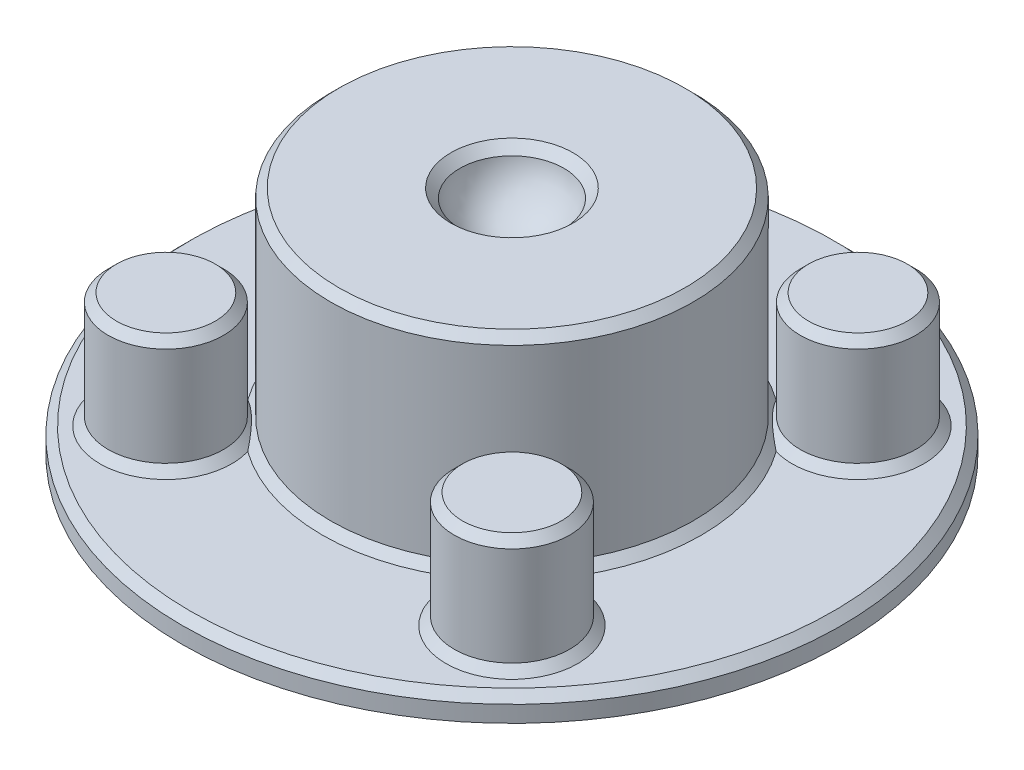
ISO-10303-21;
HEADER;
FILE_DESCRIPTION(('STEP AP214'),'2;1');
FILE_NAME('part.step','',(''),(''),'','','');
FILE_SCHEMA(('AUTOMOTIVE_DESIGN { 1 0 10303 214 1 1 1 1 }'));
ENDSEC;
DATA;
#1=APPLICATION_CONTEXT('core data for automotive mechanical design processes');
#2=APPLICATION_PROTOCOL_DEFINITION('international standard','automotive_design',2000,#1);
#3=PRODUCT_CONTEXT('',#1,'mechanical');
#4=PRODUCT('Part','Part','',(#3));
#5=PRODUCT_RELATED_PRODUCT_CATEGORY('part','',(#4));
#6=PRODUCT_DEFINITION_FORMATION('','',#4);
#7=PRODUCT_DEFINITION_CONTEXT('part definition',#1,'design');
#8=PRODUCT_DEFINITION('design','',#6,#7);
#9=PRODUCT_DEFINITION_SHAPE('','',#8);
#10=(LENGTH_UNIT() NAMED_UNIT(*) SI_UNIT(.MILLI.,.METRE.));
#11=(NAMED_UNIT(*) PLANE_ANGLE_UNIT() SI_UNIT($,.RADIAN.));
#12=(NAMED_UNIT(*) SI_UNIT($,.STERADIAN.) SOLID_ANGLE_UNIT());
#13=UNCERTAINTY_MEASURE_WITH_UNIT(LENGTH_MEASURE(1.E-05),#10,'distance_accuracy_value','');
#14=(GEOMETRIC_REPRESENTATION_CONTEXT(3) GLOBAL_UNCERTAINTY_ASSIGNED_CONTEXT((#13)) GLOBAL_UNIT_ASSIGNED_CONTEXT((#10,
#11,#12)) REPRESENTATION_CONTEXT('',''));
#15=CARTESIAN_POINT('',(0.,0.,0.));
#16=DIRECTION('',(0.,0.,1.));
#17=DIRECTION('',(1.,0.,0.));
#18=AXIS2_PLACEMENT_3D('',#15,#16,#17);
#19=CARTESIAN_POINT('',(0.,3.,0.));
#20=DIRECTION('',(0.,-1.,0.));
#21=DIRECTION('',(0.,0.,-1.));
#22=AXIS2_PLACEMENT_3D('',#19,#20,#21);
#23=CYLINDRICAL_SURFACE('',#22,40.);
#24=CARTESIAN_POINT('',(0.,1.99999999999998,0.));
#25=DIRECTION('',(0.,1.,0.));
#26=DIRECTION('',(0.,0.,1.));
#27=AXIS2_PLACEMENT_3D('',#24,#25,#26);
#28=CIRCLE('',#27,40.);
#29=CARTESIAN_POINT('',(0.,1.99999999999998,40.));
#30=VERTEX_POINT('',#29);
#31=EDGE_CURVE('E320',#30,#30,#28,.F.);
#32=ORIENTED_EDGE('',*,*,#31,.T.);
#33=EDGE_LOOP('',(#32));
#34=FACE_BOUND('',#33,.T.);
#35=CARTESIAN_POINT('',(0.,0.,0.));
#36=DIRECTION('',(0.,1.,0.));
#37=DIRECTION('',(0.,0.,1.));
#38=AXIS2_PLACEMENT_3D('',#35,#36,#37);
#39=CIRCLE('',#38,40.);
#40=CARTESIAN_POINT('',(0.,0.,40.));
#41=VERTEX_POINT('',#40);
#42=EDGE_CURVE('E103',#41,#41,#39,.T.);
#43=ORIENTED_EDGE('',*,*,#42,.T.);
#44=EDGE_LOOP('',(#43));
#45=FACE_BOUND('',#44,.T.);
#46=ADVANCED_FACE('F43',(#34,#45),#23,.T.);
#47=CARTESIAN_POINT('',(0.,3.,0.));
#48=DIRECTION('',(0.,1.,0.));
#49=DIRECTION('',(0.,0.,1.));
#50=AXIS2_PLACEMENT_3D('',#47,#48,#49);
#51=PLANE('',#50);
#52=CARTESIAN_POINT('',(0.,3.,0.));
#53=DIRECTION('',(0.,1.,0.));
#54=DIRECTION('',(0.,0.,1.));
#55=AXIS2_PLACEMENT_3D('',#52,#53,#54);
#56=CIRCLE('',#55,39.);
#57=CARTESIAN_POINT('',(0.,3.,39.));
#58=VERTEX_POINT('',#57);
#59=EDGE_CURVE('E313',#58,#58,#56,.T.);
#60=ORIENTED_EDGE('',*,*,#59,.T.);
#61=EDGE_LOOP('',(#60));
#62=FACE_BOUND('',#61,.T.);
#63=CARTESIAN_POINT('',(0.,3.,0.));
#64=DIRECTION('',(0.,1.,0.));
#65=DIRECTION('',(0.,0.,1.));
#66=AXIS2_PLACEMENT_3D('',#63,#64,#65);
#67=CIRCLE('',#66,23.);
#68=CARTESIAN_POINT('',(-13.3235440574766,3.,-18.7478845139519));
#69=VERTEX_POINT('',#68);
#70=CARTESIAN_POINT('',(13.3235440574766,3.,-18.7478845139519));
#71=VERTEX_POINT('',#70);
#72=EDGE_CURVE('E59',#69,#71,#67,.F.);
#73=ORIENTED_EDGE('',*,*,#72,.T.);
#74=CARTESIAN_POINT('',(21.,3.,-21.));
#75=DIRECTION('',(0.,1.,0.));
#76=DIRECTION('',(0.,0.,1.));
#77=AXIS2_PLACEMENT_3D('',#74,#75,#76);
#78=CIRCLE('',#77,7.99999999999998);
#79=CARTESIAN_POINT('',(18.7478845139519,3.,-13.3235440574766));
#80=VERTEX_POINT('',#79);
#81=EDGE_CURVE('E63',#71,#80,#78,.F.);
#82=ORIENTED_EDGE('',*,*,#81,.T.);
#83=CARTESIAN_POINT('',(0.,3.,0.));
#84=DIRECTION('',(0.,1.,0.));
#85=DIRECTION('',(0.,0.,1.));
#86=AXIS2_PLACEMENT_3D('',#83,#84,#85);
#87=CIRCLE('',#86,23.);
#88=CARTESIAN_POINT('',(18.747884513952,3.,13.3235440574766));
#89=VERTEX_POINT('',#88);
#90=EDGE_CURVE('E311',#80,#89,#87,.F.);
#91=ORIENTED_EDGE('',*,*,#90,.T.);
#92=CARTESIAN_POINT('',(21.,3.,21.));
#93=DIRECTION('',(0.,1.,0.));
#94=DIRECTION('',(0.,0.,1.));
#95=AXIS2_PLACEMENT_3D('',#92,#93,#94);
#96=CIRCLE('',#95,8.00000000000001);
#97=CARTESIAN_POINT('',(13.3235440574766,3.,18.747884513952));
#98=VERTEX_POINT('',#97);
#99=EDGE_CURVE('E88',#89,#98,#96,.F.);
#100=ORIENTED_EDGE('',*,*,#99,.T.);
#101=CARTESIAN_POINT('',(0.,3.,0.));
#102=DIRECTION('',(0.,1.,0.));
#103=DIRECTION('',(0.,0.,1.));
#104=AXIS2_PLACEMENT_3D('',#101,#102,#103);
#105=CIRCLE('',#104,23.);
#106=CARTESIAN_POINT('',(-13.3235440574766,3.,18.747884513952));
#107=VERTEX_POINT('',#106);
#108=EDGE_CURVE('E81',#98,#107,#105,.F.);
#109=ORIENTED_EDGE('',*,*,#108,.T.);
#110=CARTESIAN_POINT('',(-21.,3.,21.));
#111=DIRECTION('',(0.,1.,0.));
#112=DIRECTION('',(0.,0.,1.));
#113=AXIS2_PLACEMENT_3D('',#110,#111,#112);
#114=CIRCLE('',#113,8.00000000000001);
#115=CARTESIAN_POINT('',(-18.747884513952,3.,13.3235440574766));
#116=VERTEX_POINT('',#115);
#117=EDGE_CURVE('E85',#107,#116,#114,.F.);
#118=ORIENTED_EDGE('',*,*,#117,.T.);
#119=CARTESIAN_POINT('',(0.,3.,0.));
#120=DIRECTION('',(0.,1.,0.));
#121=DIRECTION('',(0.,0.,1.));
#122=AXIS2_PLACEMENT_3D('',#119,#120,#121);
#123=CIRCLE('',#122,23.);
#124=CARTESIAN_POINT('',(-18.7478845139519,3.,-13.3235440574766));
#125=VERTEX_POINT('',#124);
#126=EDGE_CURVE('E93',#116,#125,#123,.F.);
#127=ORIENTED_EDGE('',*,*,#126,.T.);
#128=CARTESIAN_POINT('',(-21.,3.,-21.));
#129=DIRECTION('',(0.,1.,0.));
#130=DIRECTION('',(0.,0.,1.));
#131=AXIS2_PLACEMENT_3D('',#128,#129,#130);
#132=CIRCLE('',#131,7.99999999999998);
#133=EDGE_CURVE('E309',#125,#69,#132,.F.);
#134=ORIENTED_EDGE('',*,*,#133,.T.);
#135=EDGE_LOOP('',(#73,#82,#91,#100,#109,#118,#127,#134));
#136=FACE_BOUND('',#135,.T.);
#137=ADVANCED_FACE('F83',(#62,#136),#51,.T.);
#138=CARTESIAN_POINT('',(0.,0.,0.));
#139=DIRECTION('',(0.,1.,0.));
#140=DIRECTION('',(0.,0.,1.));
#141=AXIS2_PLACEMENT_3D('',#138,#139,#140);
#142=PLANE('',#141);
#143=CARTESIAN_POINT('',(21.,0.,-21.));
#144=DIRECTION('',(0.,1.,0.));
#145=DIRECTION('',(0.,0.,1.));
#146=AXIS2_PLACEMENT_3D('',#143,#144,#145);
#147=CIRCLE('',#146,6.25000000000001);
#148=CARTESIAN_POINT('',(21.,0.,-14.75));
#149=VERTEX_POINT('',#148);
#150=EDGE_CURVE('E373',#149,#149,#147,.T.);
#151=ORIENTED_EDGE('',*,*,#150,.T.);
#152=EDGE_LOOP('',(#151));
#153=FACE_BOUND('',#152,.T.);
#154=CARTESIAN_POINT('',(-21.,0.,-21.));
#155=DIRECTION('',(0.,1.,0.));
#156=DIRECTION('',(0.,0.,1.));
#157=AXIS2_PLACEMENT_3D('',#154,#155,#156);
#158=CIRCLE('',#157,6.25000000000001);
#159=CARTESIAN_POINT('',(-21.,0.,-14.75));
#160=VERTEX_POINT('',#159);
#161=EDGE_CURVE('E370',#160,#160,#158,.T.);
#162=ORIENTED_EDGE('',*,*,#161,.T.);
#163=EDGE_LOOP('',(#162));
#164=FACE_BOUND('',#163,.T.);
#165=CARTESIAN_POINT('',(21.,0.,21.));
#166=DIRECTION('',(0.,1.,0.));
#167=DIRECTION('',(0.,0.,1.));
#168=AXIS2_PLACEMENT_3D('',#165,#166,#167);
#169=CIRCLE('',#168,6.25000000000001);
#170=CARTESIAN_POINT('',(21.,0.,27.25));
#171=VERTEX_POINT('',#170);
#172=EDGE_CURVE('E365',#171,#171,#169,.T.);
#173=ORIENTED_EDGE('',*,*,#172,.T.);
#174=EDGE_LOOP('',(#173));
#175=FACE_BOUND('',#174,.T.);
#176=CARTESIAN_POINT('',(-21.,0.,21.));
#177=DIRECTION('',(0.,1.,0.));
#178=DIRECTION('',(0.,0.,1.));
#179=AXIS2_PLACEMENT_3D('',#176,#177,#178);
#180=CIRCLE('',#179,6.25000000000001);
#181=CARTESIAN_POINT('',(-21.,0.,27.25));
#182=VERTEX_POINT('',#181);
#183=EDGE_CURVE('E361',#182,#182,#180,.T.);
#184=ORIENTED_EDGE('',*,*,#183,.T.);
#185=EDGE_LOOP('',(#184));
#186=FACE_BOUND('',#185,.T.);
#187=ORIENTED_EDGE('',*,*,#42,.F.);
#188=EDGE_LOOP('',(#187));
#189=FACE_BOUND('',#188,.T.);
#190=ADVANCED_FACE('F233',(#153,#164,#175,#186,#189),#142,.F.);
#191=CARTESIAN_POINT('',(0.,28.,0.));
#192=DIRECTION('',(0.,-1.,0.));
#193=DIRECTION('',(0.,0.,-1.));
#194=AXIS2_PLACEMENT_3D('',#191,#192,#193);
#195=CYLINDRICAL_SURFACE('',#194,22.);
#196=CARTESIAN_POINT('',(0.,27.,0.));
#197=DIRECTION('',(0.,1.,0.));
#198=DIRECTION('',(0.,0.,1.));
#199=AXIS2_PLACEMENT_3D('',#196,#197,#198);
#200=CIRCLE('',#199,22.);
#201=CARTESIAN_POINT('',(0.,27.,22.));
#202=VERTEX_POINT('',#201);
#203=EDGE_CURVE('E486',#202,#202,#200,.F.);
#204=ORIENTED_EDGE('',*,*,#203,.T.);
#205=EDGE_LOOP('',(#204));
#206=FACE_BOUND('',#205,.T.);
#207=CARTESIAN_POINT('',(0.,4.,0.));
#208=DIRECTION('',(0.,1.,0.));
#209=DIRECTION('',(0.,0.,1.));
#210=AXIS2_PLACEMENT_3D('',#207,#208,#209);
#211=CIRCLE('',#210,22.);
#212=CARTESIAN_POINT('',(0.,4.,22.));
#213=VERTEX_POINT('',#212);
#214=EDGE_CURVE('E489',#213,#213,#211,.T.);
#215=ORIENTED_EDGE('',*,*,#214,.T.);
#216=EDGE_LOOP('',(#215));
#217=FACE_BOUND('',#216,.T.);
#218=ADVANCED_FACE('F475',(#206,#217),#195,.T.);
#219=CARTESIAN_POINT('',(0.,28.,0.));
#220=DIRECTION('',(0.,1.,0.));
#221=DIRECTION('',(0.,0.,1.));
#222=AXIS2_PLACEMENT_3D('',#219,#220,#221);
#223=PLANE('',#222);
#224=CARTESIAN_POINT('',(0.,28.,0.));
#225=DIRECTION('',(0.,1.,0.));
#226=DIRECTION('',(0.,0.,1.));
#227=AXIS2_PLACEMENT_3D('',#224,#225,#226);
#228=CIRCLE('',#227,21.);
#229=CARTESIAN_POINT('',(0.,28.,21.));
#230=VERTEX_POINT('',#229);
#231=EDGE_CURVE('E490',#230,#230,#228,.T.);
#232=ORIENTED_EDGE('',*,*,#231,.T.);
#233=EDGE_LOOP('',(#232));
#234=FACE_BOUND('',#233,.T.);
#235=CARTESIAN_POINT('',(0.,28.,0.));
#236=DIRECTION('',(0.,1.,0.));
#237=DIRECTION('',(0.,0.,1.));
#238=AXIS2_PLACEMENT_3D('',#235,#236,#237);
#239=CIRCLE('',#238,7.41349999999998);
#240=CARTESIAN_POINT('',(0.,28.,7.41349999999998));
#241=VERTEX_POINT('',#240);
#242=EDGE_CURVE('E107',#241,#241,#239,.F.);
#243=ORIENTED_EDGE('',*,*,#242,.T.);
#244=EDGE_LOOP('',(#243));
#245=FACE_BOUND('',#244,.T.);
#246=ADVANCED_FACE('F471',(#234,#245),#223,.T.);
#247=CARTESIAN_POINT('',(0.,28.,0.));
#248=DIRECTION('',(0.,-1.,0.));
#249=DIRECTION('',(1.,0.,0.));
#250=AXIS2_PLACEMENT_3D('',#247,#248,#249);
#251=SPHERICAL_SURFACE('',#250,6.4135);
#252=CARTESIAN_POINT('',(0.,26.9060063151775,0.));
#253=DIRECTION('',(0.,1.,0.));
#254=DIRECTION('',(0.,0.,1.));
#255=AXIS2_PLACEMENT_3D('',#252,#253,#254);
#256=CIRCLE('',#255,6.31950631517752);
#257=CARTESIAN_POINT('',(0.,26.9060063151775,6.31950631517752));
#258=VERTEX_POINT('',#257);
#259=EDGE_CURVE('E99',#258,#258,#256,.T.);
#260=ORIENTED_EDGE('',*,*,#259,.T.);
#261=EDGE_LOOP('',(#260));
#262=FACE_BOUND('',#261,.T.);
#263=ADVANCED_FACE('F467',(#262),#251,.F.);
#264=CARTESIAN_POINT('',(-21.,17.,-21.));
#265=DIRECTION('',(0.,-1.,0.));
#266=DIRECTION('',(0.,0.,-1.));
#267=AXIS2_PLACEMENT_3D('',#264,#265,#266);
#268=CYLINDRICAL_SURFACE('',#267,7.);
#269=CARTESIAN_POINT('',(-21.,3.99999999999998,-21.));
#270=DIRECTION('',(0.,1.,0.));
#271=DIRECTION('',(0.,0.,1.));
#272=AXIS2_PLACEMENT_3D('',#269,#270,#271);
#273=CIRCLE('',#272,7.);
#274=CARTESIAN_POINT('',(-21.,3.99999999999998,-14.));
#275=VERTEX_POINT('',#274);
#276=EDGE_CURVE('E306',#275,#275,#273,.T.);
#277=ORIENTED_EDGE('',*,*,#276,.T.);
#278=EDGE_LOOP('',(#277));
#279=FACE_BOUND('',#278,.T.);
#280=CARTESIAN_POINT('',(-21.,16.,-21.));
#281=DIRECTION('',(0.,1.,0.));
#282=DIRECTION('',(0.,0.,1.));
#283=AXIS2_PLACEMENT_3D('',#280,#281,#282);
#284=CIRCLE('',#283,7.);
#285=CARTESIAN_POINT('',(-21.,16.,-14.));
#286=VERTEX_POINT('',#285);
#287=EDGE_CURVE('E322',#286,#286,#284,.F.);
#288=ORIENTED_EDGE('',*,*,#287,.T.);
#289=EDGE_LOOP('',(#288));
#290=FACE_BOUND('',#289,.T.);
#291=ADVANCED_FACE('F464',(#279,#290),#268,.T.);
#292=CARTESIAN_POINT('',(-21.,17.,-21.));
#293=DIRECTION('',(0.,1.,0.));
#294=DIRECTION('',(0.,0.,1.));
#295=AXIS2_PLACEMENT_3D('',#292,#293,#294);
#296=PLANE('',#295);
#297=CARTESIAN_POINT('',(-21.,17.,-21.));
#298=DIRECTION('',(0.,1.,0.));
#299=DIRECTION('',(0.,0.,1.));
#300=AXIS2_PLACEMENT_3D('',#297,#298,#299);
#301=CIRCLE('',#300,6.00000000000001);
#302=CARTESIAN_POINT('',(-21.,17.,-15.));
#303=VERTEX_POINT('',#302);
#304=EDGE_CURVE('E274',#303,#303,#301,.T.);
#305=ORIENTED_EDGE('',*,*,#304,.T.);
#306=EDGE_LOOP('',(#305));
#307=FACE_BOUND('',#306,.T.);
#308=ADVANCED_FACE('F457',(#307),#296,.T.);
#309=CARTESIAN_POINT('',(21.,17.,-21.));
#310=DIRECTION('',(0.,-1.,0.));
#311=DIRECTION('',(0.,0.,-1.));
#312=AXIS2_PLACEMENT_3D('',#309,#310,#311);
#313=CYLINDRICAL_SURFACE('',#312,7.);
#314=CARTESIAN_POINT('',(21.,3.99999999999998,-21.));
#315=DIRECTION('',(0.,1.,0.));
#316=DIRECTION('',(0.,0.,1.));
#317=AXIS2_PLACEMENT_3D('',#314,#315,#316);
#318=CIRCLE('',#317,7.);
#319=CARTESIAN_POINT('',(21.,3.99999999999998,-14.));
#320=VERTEX_POINT('',#319);
#321=EDGE_CURVE('E329',#320,#320,#318,.T.);
#322=ORIENTED_EDGE('',*,*,#321,.T.);
#323=EDGE_LOOP('',(#322));
#324=FACE_BOUND('',#323,.T.);
#325=CARTESIAN_POINT('',(21.,16.,-21.));
#326=DIRECTION('',(0.,1.,0.));
#327=DIRECTION('',(0.,0.,1.));
#328=AXIS2_PLACEMENT_3D('',#325,#326,#327);
#329=CIRCLE('',#328,7.);
#330=CARTESIAN_POINT('',(21.,16.,-14.));
#331=VERTEX_POINT('',#330);
#332=EDGE_CURVE('E326',#331,#331,#329,.F.);
#333=ORIENTED_EDGE('',*,*,#332,.T.);
#334=EDGE_LOOP('',(#333));
#335=FACE_BOUND('',#334,.T.);
#336=ADVANCED_FACE('F454',(#324,#335),#313,.T.);
#337=CARTESIAN_POINT('',(21.,17.,-21.));
#338=DIRECTION('',(0.,1.,0.));
#339=DIRECTION('',(0.,0.,1.));
#340=AXIS2_PLACEMENT_3D('',#337,#338,#339);
#341=PLANE('',#340);
#342=CARTESIAN_POINT('',(21.,17.,-21.));
#343=DIRECTION('',(0.,1.,0.));
#344=DIRECTION('',(0.,0.,1.));
#345=AXIS2_PLACEMENT_3D('',#342,#343,#344);
#346=CIRCLE('',#345,6.00000000000001);
#347=CARTESIAN_POINT('',(21.,17.,-15.));
#348=VERTEX_POINT('',#347);
#349=EDGE_CURVE('E344',#348,#348,#346,.T.);
#350=ORIENTED_EDGE('',*,*,#349,.T.);
#351=EDGE_LOOP('',(#350));
#352=FACE_BOUND('',#351,.T.);
#353=ADVANCED_FACE('F449',(#352),#341,.T.);
#354=CARTESIAN_POINT('',(21.,17.,21.));
#355=DIRECTION('',(0.,-1.,0.));
#356=DIRECTION('',(0.,0.,-1.));
#357=AXIS2_PLACEMENT_3D('',#354,#355,#356);
#358=CYLINDRICAL_SURFACE('',#357,7.);
#359=CARTESIAN_POINT('',(21.,4.00000000000002,21.));
#360=DIRECTION('',(0.,1.,0.));
#361=DIRECTION('',(0.,0.,1.));
#362=AXIS2_PLACEMENT_3D('',#359,#360,#361);
#363=CIRCLE('',#362,7.);
#364=CARTESIAN_POINT('',(21.,4.00000000000002,28.));
#365=VERTEX_POINT('',#364);
#366=EDGE_CURVE('E335',#365,#365,#363,.T.);
#367=ORIENTED_EDGE('',*,*,#366,.T.);
#368=EDGE_LOOP('',(#367));
#369=FACE_BOUND('',#368,.T.);
#370=CARTESIAN_POINT('',(21.,16.,21.));
#371=DIRECTION('',(0.,1.,0.));
#372=DIRECTION('',(0.,0.,1.));
#373=AXIS2_PLACEMENT_3D('',#370,#371,#372);
#374=CIRCLE('',#373,7.);
#375=CARTESIAN_POINT('',(21.,16.,28.));
#376=VERTEX_POINT('',#375);
#377=EDGE_CURVE('E332',#376,#376,#374,.F.);
#378=ORIENTED_EDGE('',*,*,#377,.T.);
#379=EDGE_LOOP('',(#378));
#380=FACE_BOUND('',#379,.T.);
#381=ADVANCED_FACE('F446',(#369,#380),#358,.T.);
#382=CARTESIAN_POINT('',(21.,17.,21.));
#383=DIRECTION('',(0.,1.,0.));
#384=DIRECTION('',(0.,0.,1.));
#385=AXIS2_PLACEMENT_3D('',#382,#383,#384);
#386=PLANE('',#385);
#387=CARTESIAN_POINT('',(21.,17.,21.));
#388=DIRECTION('',(0.,1.,0.));
#389=DIRECTION('',(0.,0.,1.));
#390=AXIS2_PLACEMENT_3D('',#387,#388,#389);
#391=CIRCLE('',#390,6.00000000000003);
#392=CARTESIAN_POINT('',(21.,17.,27.));
#393=VERTEX_POINT('',#392);
#394=EDGE_CURVE('E347',#393,#393,#391,.T.);
#395=ORIENTED_EDGE('',*,*,#394,.T.);
#396=EDGE_LOOP('',(#395));
#397=FACE_BOUND('',#396,.T.);
#398=ADVANCED_FACE('F442',(#397),#386,.T.);
#399=CARTESIAN_POINT('',(-21.,17.,21.));
#400=DIRECTION('',(0.,-1.,0.));
#401=DIRECTION('',(0.,0.,-1.));
#402=AXIS2_PLACEMENT_3D('',#399,#400,#401);
#403=CYLINDRICAL_SURFACE('',#402,7.);
#404=CARTESIAN_POINT('',(-21.,4.00000000000002,21.));
#405=DIRECTION('',(0.,1.,0.));
#406=DIRECTION('',(0.,0.,1.));
#407=AXIS2_PLACEMENT_3D('',#404,#405,#406);
#408=CIRCLE('',#407,7.);
#409=CARTESIAN_POINT('',(-21.,4.00000000000002,28.));
#410=VERTEX_POINT('',#409);
#411=EDGE_CURVE('E341',#410,#410,#408,.T.);
#412=ORIENTED_EDGE('',*,*,#411,.T.);
#413=EDGE_LOOP('',(#412));
#414=FACE_BOUND('',#413,.T.);
#415=CARTESIAN_POINT('',(-21.,16.,21.));
#416=DIRECTION('',(0.,1.,0.));
#417=DIRECTION('',(0.,0.,1.));
#418=AXIS2_PLACEMENT_3D('',#415,#416,#417);
#419=CIRCLE('',#418,7.);
#420=CARTESIAN_POINT('',(-21.,16.,28.));
#421=VERTEX_POINT('',#420);
#422=EDGE_CURVE('E338',#421,#421,#419,.F.);
#423=ORIENTED_EDGE('',*,*,#422,.T.);
#424=EDGE_LOOP('',(#423));
#425=FACE_BOUND('',#424,.T.);
#426=ADVANCED_FACE('F439',(#414,#425),#403,.T.);
#427=CARTESIAN_POINT('',(-21.,17.,21.));
#428=DIRECTION('',(0.,1.,0.));
#429=DIRECTION('',(0.,0.,1.));
#430=AXIS2_PLACEMENT_3D('',#427,#428,#429);
#431=PLANE('',#430);
#432=CARTESIAN_POINT('',(-21.,17.,21.));
#433=DIRECTION('',(0.,1.,0.));
#434=DIRECTION('',(0.,0.,1.));
#435=AXIS2_PLACEMENT_3D('',#432,#433,#434);
#436=CIRCLE('',#435,6.00000000000001);
#437=CARTESIAN_POINT('',(-21.,17.,27.));
#438=VERTEX_POINT('',#437);
#439=EDGE_CURVE('E349',#438,#438,#436,.T.);
#440=ORIENTED_EDGE('',*,*,#439,.T.);
#441=EDGE_LOOP('',(#440));
#442=FACE_BOUND('',#441,.T.);
#443=ADVANCED_FACE('F437',(#442),#431,.T.);
#444=CARTESIAN_POINT('',(-21.,14.,-21.));
#445=DIRECTION('',(0.,-1.,0.));
#446=DIRECTION('',(0.,0.,-1.));
#447=AXIS2_PLACEMENT_3D('',#444,#445,#446);
#448=CYLINDRICAL_SURFACE('',#447,5.25);
#449=CARTESIAN_POINT('',(-21.,0.999999999999996,-21.));
#450=DIRECTION('',(0.,1.,0.));
#451=DIRECTION('',(0.,0.,1.));
#452=AXIS2_PLACEMENT_3D('',#449,#450,#451);
#453=CIRCLE('',#452,5.25);
#454=CARTESIAN_POINT('',(-21.,0.999999999999996,-15.75));
#455=VERTEX_POINT('',#454);
#456=EDGE_CURVE('E382',#455,#455,#453,.F.);
#457=ORIENTED_EDGE('',*,*,#456,.T.);
#458=EDGE_LOOP('',(#457));
#459=FACE_BOUND('',#458,.T.);
#460=CARTESIAN_POINT('',(-21.,13.,-21.));
#461=DIRECTION('',(0.,-1.,0.));
#462=DIRECTION('',(0.,0.,-1.));
#463=AXIS2_PLACEMENT_3D('',#460,#461,#462);
#464=CIRCLE('',#463,5.25);
#465=CARTESIAN_POINT('',(-21.,13.,-26.25));
#466=VERTEX_POINT('',#465);
#467=EDGE_CURVE('E379',#466,#466,#464,.F.);
#468=ORIENTED_EDGE('',*,*,#467,.T.);
#469=EDGE_LOOP('',(#468));
#470=FACE_BOUND('',#469,.T.);
#471=ADVANCED_FACE('F433',(#459,#470),#448,.F.);
#472=CARTESIAN_POINT('',(-21.,14.,-21.));
#473=DIRECTION('',(0.,-1.,0.));
#474=DIRECTION('',(0.,0.,-1.));
#475=AXIS2_PLACEMENT_3D('',#472,#473,#474);
#476=PLANE('',#475);
#477=CARTESIAN_POINT('',(-21.,14.,-21.));
#478=DIRECTION('',(0.,-1.,0.));
#479=DIRECTION('',(0.,0.,-1.));
#480=AXIS2_PLACEMENT_3D('',#477,#478,#479);
#481=CIRCLE('',#480,4.24999999999999);
#482=CARTESIAN_POINT('',(-21.,14.,-25.25));
#483=VERTEX_POINT('',#482);
#484=EDGE_CURVE('E385',#483,#483,#481,.T.);
#485=ORIENTED_EDGE('',*,*,#484,.T.);
#486=EDGE_LOOP('',(#485));
#487=FACE_BOUND('',#486,.T.);
#488=ADVANCED_FACE('F406',(#487),#476,.T.);
#489=CARTESIAN_POINT('',(-21.,14.,21.));
#490=DIRECTION('',(0.,-1.,0.));
#491=DIRECTION('',(0.,0.,-1.));
#492=AXIS2_PLACEMENT_3D('',#489,#490,#491);
#493=CYLINDRICAL_SURFACE('',#492,5.25);
#494=CARTESIAN_POINT('',(-21.,0.999999999999996,21.));
#495=DIRECTION('',(0.,1.,0.));
#496=DIRECTION('',(0.,0.,1.));
#497=AXIS2_PLACEMENT_3D('',#494,#495,#496);
#498=CIRCLE('',#497,5.25);
#499=CARTESIAN_POINT('',(-21.,0.999999999999996,26.25));
#500=VERTEX_POINT('',#499);
#501=EDGE_CURVE('E52',#500,#500,#498,.F.);
#502=ORIENTED_EDGE('',*,*,#501,.T.);
#503=EDGE_LOOP('',(#502));
#504=FACE_BOUND('',#503,.T.);
#505=CARTESIAN_POINT('',(-21.,13.,21.));
#506=DIRECTION('',(0.,-1.,0.));
#507=DIRECTION('',(0.,0.,-1.));
#508=AXIS2_PLACEMENT_3D('',#505,#506,#507);
#509=CIRCLE('',#508,5.25);
#510=CARTESIAN_POINT('',(-21.,13.,15.75));
#511=VERTEX_POINT('',#510);
#512=EDGE_CURVE('E397',#511,#511,#509,.F.);
#513=ORIENTED_EDGE('',*,*,#512,.T.);
#514=EDGE_LOOP('',(#513));
#515=FACE_BOUND('',#514,.T.);
#516=ADVANCED_FACE('F402',(#504,#515),#493,.F.);
#517=CARTESIAN_POINT('',(-21.,14.,21.));
#518=DIRECTION('',(0.,-1.,0.));
#519=DIRECTION('',(0.,0.,-1.));
#520=AXIS2_PLACEMENT_3D('',#517,#518,#519);
#521=PLANE('',#520);
#522=CARTESIAN_POINT('',(-21.,14.,21.));
#523=DIRECTION('',(0.,-1.,0.));
#524=DIRECTION('',(0.,0.,-1.));
#525=AXIS2_PLACEMENT_3D('',#522,#523,#524);
#526=CIRCLE('',#525,4.24999999999999);
#527=CARTESIAN_POINT('',(-21.,14.,16.75));
#528=VERTEX_POINT('',#527);
#529=EDGE_CURVE('E11',#528,#528,#526,.T.);
#530=ORIENTED_EDGE('',*,*,#529,.T.);
#531=EDGE_LOOP('',(#530));
#532=FACE_BOUND('',#531,.T.);
#533=ADVANCED_FACE('F405',(#532),#521,.T.);
#534=CARTESIAN_POINT('',(21.,14.,21.));
#535=DIRECTION('',(0.,-1.,0.));
#536=DIRECTION('',(0.,0.,-1.));
#537=AXIS2_PLACEMENT_3D('',#534,#535,#536);
#538=CYLINDRICAL_SURFACE('',#537,5.25);
#539=CARTESIAN_POINT('',(21.,0.999999999999999,21.));
#540=DIRECTION('',(0.,1.,0.));
#541=DIRECTION('',(0.,0.,1.));
#542=AXIS2_PLACEMENT_3D('',#539,#540,#541);
#543=CIRCLE('',#542,5.25);
#544=CARTESIAN_POINT('',(21.,0.999999999999999,26.25));
#545=VERTEX_POINT('',#544);
#546=EDGE_CURVE('E391',#545,#545,#543,.F.);
#547=ORIENTED_EDGE('',*,*,#546,.T.);
#548=EDGE_LOOP('',(#547));
#549=FACE_BOUND('',#548,.T.);
#550=CARTESIAN_POINT('',(21.,13.,21.));
#551=DIRECTION('',(0.,-1.,0.));
#552=DIRECTION('',(0.,0.,-1.));
#553=AXIS2_PLACEMENT_3D('',#550,#551,#552);
#554=CIRCLE('',#553,5.25);
#555=CARTESIAN_POINT('',(21.,13.,15.75));
#556=VERTEX_POINT('',#555);
#557=EDGE_CURVE('E388',#556,#556,#554,.F.);
#558=ORIENTED_EDGE('',*,*,#557,.T.);
#559=EDGE_LOOP('',(#558));
#560=FACE_BOUND('',#559,.T.);
#561=ADVANCED_FACE('F413',(#549,#560),#538,.F.);
#562=CARTESIAN_POINT('',(21.,14.,21.));
#563=DIRECTION('',(0.,-1.,0.));
#564=DIRECTION('',(0.,0.,-1.));
#565=AXIS2_PLACEMENT_3D('',#562,#563,#564);
#566=PLANE('',#565);
#567=CARTESIAN_POINT('',(21.,14.,21.));
#568=DIRECTION('',(0.,-1.,0.));
#569=DIRECTION('',(0.,0.,-1.));
#570=AXIS2_PLACEMENT_3D('',#567,#568,#569);
#571=CIRCLE('',#570,4.25);
#572=CARTESIAN_POINT('',(21.,14.,16.75));
#573=VERTEX_POINT('',#572);
#574=EDGE_CURVE('E394',#573,#573,#571,.T.);
#575=ORIENTED_EDGE('',*,*,#574,.T.);
#576=EDGE_LOOP('',(#575));
#577=FACE_BOUND('',#576,.T.);
#578=ADVANCED_FACE('F418',(#577),#566,.T.);
#579=CARTESIAN_POINT('',(21.,14.,-21.));
#580=DIRECTION('',(0.,-1.,0.));
#581=DIRECTION('',(0.,0.,-1.));
#582=AXIS2_PLACEMENT_3D('',#579,#580,#581);
#583=CYLINDRICAL_SURFACE('',#582,5.25);
#584=CARTESIAN_POINT('',(21.,0.999999999999996,-21.));
#585=DIRECTION('',(0.,1.,0.));
#586=DIRECTION('',(0.,0.,1.));
#587=AXIS2_PLACEMENT_3D('',#584,#585,#586);
#588=CIRCLE('',#587,5.25);
#589=CARTESIAN_POINT('',(21.,0.999999999999996,-15.75));
#590=VERTEX_POINT('',#589);
#591=EDGE_CURVE('E357',#590,#590,#588,.F.);
#592=ORIENTED_EDGE('',*,*,#591,.T.);
#593=EDGE_LOOP('',(#592));
#594=FACE_BOUND('',#593,.T.);
#595=CARTESIAN_POINT('',(21.,13.,-21.));
#596=DIRECTION('',(0.,-1.,0.));
#597=DIRECTION('',(0.,0.,-1.));
#598=AXIS2_PLACEMENT_3D('',#595,#596,#597);
#599=CIRCLE('',#598,5.25);
#600=CARTESIAN_POINT('',(21.,13.,-26.25));
#601=VERTEX_POINT('',#600);
#602=EDGE_CURVE('E125',#601,#601,#599,.F.);
#603=ORIENTED_EDGE('',*,*,#602,.T.);
#604=EDGE_LOOP('',(#603));
#605=FACE_BOUND('',#604,.T.);
#606=ADVANCED_FACE('F424',(#594,#605),#583,.F.);
#607=CARTESIAN_POINT('',(21.,14.,-21.));
#608=DIRECTION('',(0.,-1.,0.));
#609=DIRECTION('',(0.,0.,-1.));
#610=AXIS2_PLACEMENT_3D('',#607,#608,#609);
#611=PLANE('',#610);
#612=CARTESIAN_POINT('',(21.,14.,-21.));
#613=DIRECTION('',(0.,-1.,0.));
#614=DIRECTION('',(0.,0.,-1.));
#615=AXIS2_PLACEMENT_3D('',#612,#613,#614);
#616=CIRCLE('',#615,4.24999999999999);
#617=CARTESIAN_POINT('',(21.,14.,-25.25));
#618=VERTEX_POINT('',#617);
#619=EDGE_CURVE('E376',#618,#618,#616,.T.);
#620=ORIENTED_EDGE('',*,*,#619,.T.);
#621=EDGE_LOOP('',(#620));
#622=FACE_BOUND('',#621,.T.);
#623=ADVANCED_FACE('F248',(#622),#611,.T.);
#624=CARTESIAN_POINT('',(0.,28.,0.));
#625=DIRECTION('',(0.,-1.,0.));
#626=DIRECTION('',(0.,0.,-1.));
#627=AXIS2_PLACEMENT_3D('',#624,#625,#626);
#628=CONICAL_SURFACE('',#627,21.,0.785398163397445);
#629=ORIENTED_EDGE('',*,*,#203,.F.);
#630=EDGE_LOOP('',(#629));
#631=FACE_BOUND('',#630,.T.);
#632=ORIENTED_EDGE('',*,*,#231,.F.);
#633=EDGE_LOOP('',(#632));
#634=FACE_BOUND('',#633,.T.);
#635=ADVANCED_FACE('F241',(#631,#634),#628,.T.);
#636=CARTESIAN_POINT('',(0.,28.,0.));
#637=DIRECTION('',(0.,1.,0.));
#638=DIRECTION('',(0.,0.,1.));
#639=AXIS2_PLACEMENT_3D('',#636,#637,#638);
#640=CONICAL_SURFACE('',#639,7.41349999999998,0.785398163397445);
#641=ORIENTED_EDGE('',*,*,#259,.F.);
#642=EDGE_LOOP('',(#641));
#643=FACE_BOUND('',#642,.T.);
#644=ORIENTED_EDGE('',*,*,#242,.F.);
#645=EDGE_LOOP('',(#644));
#646=FACE_BOUND('',#645,.T.);
#647=ADVANCED_FACE('F247',(#643,#646),#640,.F.);
#648=CARTESIAN_POINT('',(0.,3.,0.));
#649=DIRECTION('',(0.,-1.,0.));
#650=DIRECTION('',(0.,0.,-1.));
#651=AXIS2_PLACEMENT_3D('',#648,#649,#650);
#652=CONICAL_SURFACE('',#651,39.,0.785398163397441);
#653=ORIENTED_EDGE('',*,*,#31,.F.);
#654=EDGE_LOOP('',(#653));
#655=FACE_BOUND('',#654,.T.);
#656=ORIENTED_EDGE('',*,*,#59,.F.);
#657=EDGE_LOOP('',(#656));
#658=FACE_BOUND('',#657,.T.);
#659=ADVANCED_FACE('F137',(#655,#658),#652,.T.);
#660=CARTESIAN_POINT('',(-21.,4.00000000000002,21.));
#661=DIRECTION('',(0.,-1.,0.));
#662=DIRECTION('',(0.,0.,-1.));
#663=AXIS2_PLACEMENT_3D('',#660,#661,#662);
#664=CONICAL_SURFACE('',#663,7.,0.785398163397442);
#665=ORIENTED_EDGE('',*,*,#411,.F.);
#666=EDGE_LOOP('',(#665));
#667=FACE_BOUND('',#666,.T.);
#668=CARTESIAN_POINT('',(-13.3231898089747,2.9998,18.7483816195968));
#669=CARTESIAN_POINT('',(-13.4159319596725,3.05216309373622,18.6182372590936));
#670=CARTESIAN_POINT('',(-13.5103655031865,3.10192348301435,18.4882605803836));
#671=CARTESIAN_POINT('',(-13.7027505066285,3.19580826256165,18.2288150201214));
#672=CARTESIAN_POINT('',(-13.8007030100666,3.23993096306243,18.0993463020367));
#673=CARTESIAN_POINT('',(-14.1002693620335,3.36327999091718,17.711673501587));
#674=CARTESIAN_POINT('',(-14.3073023186115,3.43332044908684,17.4546116462987));
#675=CARTESIAN_POINT('',(-14.728137297015,3.54358318733975,16.9550175691977));
#676=CARTESIAN_POINT('',(-14.941457915308,3.58475254791388,16.7122902648494));
#677=CARTESIAN_POINT('',(-15.3800514612855,3.63894964117934,16.2349845093854));
#678=CARTESIAN_POINT('',(-15.6053122495145,3.65200541499741,16.0003981683492));
#679=CARTESIAN_POINT('',(-16.060800296416,3.64935118388823,15.5468060008021));
#680=CARTESIAN_POINT('',(-16.2908004064755,3.63428434220949,15.3275679205804));
#681=CARTESIAN_POINT('',(-16.7583858301131,3.57743268274749,14.9005908251429));
#682=CARTESIAN_POINT('',(-16.9959780410473,3.53562287346664,14.6928627636405));
#683=CARTESIAN_POINT('',(-17.4845649162432,3.42541512901026,14.2829957058705));
#684=CARTESIAN_POINT('',(-17.7357375857032,3.35613760522971,14.081306981982));
#685=CARTESIAN_POINT('',(-18.114449199893,3.23483959171597,13.7892368060282));
#686=CARTESIAN_POINT('',(-18.2409151504513,3.19154938440381,13.6936924321239));
#687=CARTESIAN_POINT('',(-18.4943280551695,3.09959935600133,13.5059581191223));
#688=CARTESIAN_POINT('',(-18.6212748658577,3.05094103080187,13.4137672550031));
#689=CARTESIAN_POINT('',(-18.7483816195968,2.9998,13.3231898089747));
#690=B_SPLINE_CURVE_WITH_KNOTS('',3,(#668,#669,#670,#671,#672,#673,#674,#675,#676,#677,#678,
#679,#680,#681,#682,#683,#684,#685,#686,#687,#688,#689),.UNSPECIFIED.,.F.,.F.,(4,2,2,2,2,2,2,2,
2,2,4),(0.,0.504451198019709,1.00905324084155,2.0198370097142,2.99567918291075,3.97054757736004,
4.92339346041025,5.87713108839295,6.86425845016803,7.35707488909923,7.84975434401176),.UNSPECIFIED.);
#691=EDGE_CURVE('E97',#116,#107,#690,.F.);
#692=ORIENTED_EDGE('',*,*,#691,.F.);
#693=ORIENTED_EDGE('',*,*,#117,.F.);
#694=EDGE_LOOP('',(#692,#693));
#695=FACE_BOUND('',#694,.T.);
#696=ADVANCED_FACE('F96',(#667,#695),#664,.T.);
#697=CARTESIAN_POINT('',(-21.,3.99999999999998,-21.));
#698=DIRECTION('',(0.,-1.,0.));
#699=DIRECTION('',(0.,0.,-1.));
#700=AXIS2_PLACEMENT_3D('',#697,#698,#699);
#701=CONICAL_SURFACE('',#700,7.,0.785398163397449);
#702=ORIENTED_EDGE('',*,*,#276,.F.);
#703=EDGE_LOOP('',(#702));
#704=FACE_BOUND('',#703,.T.);
#705=CARTESIAN_POINT('',(-18.7483816195967,2.9998,-13.3231898089747));
#706=CARTESIAN_POINT('',(-18.6182372590936,3.05216309373623,-13.4159319596726));
#707=CARTESIAN_POINT('',(-18.4882605803835,3.10192348301435,-13.5103655031865));
#708=CARTESIAN_POINT('',(-18.2288150201213,3.19580826256165,-13.7027505066286));
#709=CARTESIAN_POINT('',(-18.0993463020367,3.23993096306243,-13.8007030100666));
#710=CARTESIAN_POINT('',(-17.711673501587,3.36327999091717,-14.1002693620335));
#711=CARTESIAN_POINT('',(-17.4546116462987,3.43332044908683,-14.3073023186115));
#712=CARTESIAN_POINT('',(-16.9550175691977,3.54358318733974,-14.728137297015));
#713=CARTESIAN_POINT('',(-16.7122902648494,3.58475254791387,-14.941457915308));
#714=CARTESIAN_POINT('',(-16.2349845093854,3.63894964117932,-15.3800514612856));
#715=CARTESIAN_POINT('',(-16.0003981683492,3.65200541499739,-15.6053122495146));
#716=CARTESIAN_POINT('',(-15.5468060008021,3.64935118388821,-16.060800296416));
#717=CARTESIAN_POINT('',(-15.3275679205804,3.63428434220948,-16.2908004064756));
#718=CARTESIAN_POINT('',(-14.9005908251429,3.57743268274747,-16.7583858301132));
#719=CARTESIAN_POINT('',(-14.6928627636405,3.53562287346662,-16.9959780410473));
#720=CARTESIAN_POINT('',(-14.2829957058705,3.42541512901025,-17.4845649162432));
#721=CARTESIAN_POINT('',(-14.081306981982,3.3561376052297,-17.7357375857032));
#722=CARTESIAN_POINT('',(-13.7892368060282,3.23483959171596,-18.114449199893));
#723=CARTESIAN_POINT('',(-13.6936924321239,3.1915493844038,-18.2409151504513));
#724=CARTESIAN_POINT('',(-13.5059581191223,3.09959935600132,-18.4943280551694));
#725=CARTESIAN_POINT('',(-13.4137672550031,3.05094103080187,-18.6212748658577));
#726=CARTESIAN_POINT('',(-13.3231898089747,2.9998,-18.7483816195967));
#727=B_SPLINE_CURVE_WITH_KNOTS('',3,(#705,#706,#707,#708,#709,#710,#711,#712,#713,#714,#715,
#716,#717,#718,#719,#720,#721,#722,#723,#724,#725,#726),.UNSPECIFIED.,.F.,.F.,(4,2,2,2,2,2,2,2,
2,2,4),(0.,0.504451198019711,1.00905324084155,2.0198370097142,2.99567918291076,3.97054757736004,
4.92339346041022,5.87713108839291,6.86425845016796,7.35707488909914,7.84975434401166),.UNSPECIFIED.);
#728=EDGE_CURVE('E104',#69,#125,#727,.F.);
#729=ORIENTED_EDGE('',*,*,#728,.F.);
#730=ORIENTED_EDGE('',*,*,#133,.F.);
#731=EDGE_LOOP('',(#729,#730));
#732=FACE_BOUND('',#731,.T.);
#733=ADVANCED_FACE('F136',(#704,#732),#701,.T.);
#734=CARTESIAN_POINT('',(21.,3.99999999999998,-21.));
#735=DIRECTION('',(0.,-1.,0.));
#736=DIRECTION('',(0.,0.,-1.));
#737=AXIS2_PLACEMENT_3D('',#734,#735,#736);
#738=CONICAL_SURFACE('',#737,7.,0.785398163397449);
#739=ORIENTED_EDGE('',*,*,#321,.F.);
#740=EDGE_LOOP('',(#739));
#741=FACE_BOUND('',#740,.T.);
#742=CARTESIAN_POINT('',(13.3231898089747,2.9998,-18.7483816195967));
#743=CARTESIAN_POINT('',(13.4159319596726,3.05216309373622,-18.6182372590936));
#744=CARTESIAN_POINT('',(13.5103655031865,3.10192348301435,-18.4882605803835));
#745=CARTESIAN_POINT('',(13.7027505066286,3.19580826256165,-18.2288150201213));
#746=CARTESIAN_POINT('',(13.8007030100666,3.23993096306243,-18.0993463020367));
#747=CARTESIAN_POINT('',(14.1002693620335,3.36327999091717,-17.711673501587));
#748=CARTESIAN_POINT('',(14.3073023186115,3.43332044908683,-17.4546116462987));
#749=CARTESIAN_POINT('',(14.728137297015,3.54358318733974,-16.9550175691977));
#750=CARTESIAN_POINT('',(14.941457915308,3.58475254791387,-16.7122902648494));
#751=CARTESIAN_POINT('',(15.3800514612856,3.63894964117932,-16.2349845093854));
#752=CARTESIAN_POINT('',(15.6053122495146,3.65200541499739,-16.0003981683492));
#753=CARTESIAN_POINT('',(16.060800296416,3.64935118388821,-15.5468060008021));
#754=CARTESIAN_POINT('',(16.2908004064756,3.63428434220947,-15.3275679205804));
#755=CARTESIAN_POINT('',(16.7583858301132,3.57743268274747,-14.9005908251429));
#756=CARTESIAN_POINT('',(16.9959780410473,3.53562287346662,-14.6928627636405));
#757=CARTESIAN_POINT('',(17.4845649162432,3.42541512901024,-14.2829957058705));
#758=CARTESIAN_POINT('',(17.7357375857032,3.3561376052297,-14.081306981982));
#759=CARTESIAN_POINT('',(18.114449199893,3.23483959171596,-13.7892368060282));
#760=CARTESIAN_POINT('',(18.2409151504513,3.19154938440379,-13.6936924321239));
#761=CARTESIAN_POINT('',(18.4943280551694,3.09959935600132,-13.5059581191223));
#762=CARTESIAN_POINT('',(18.6212748658577,3.05094103080186,-13.4137672550031));
#763=CARTESIAN_POINT('',(18.7483816195967,2.9998,-13.3231898089747));
#764=B_SPLINE_CURVE_WITH_KNOTS('',3,(#742,#743,#744,#745,#746,#747,#748,#749,#750,#751,#752,
#753,#754,#755,#756,#757,#758,#759,#760,#761,#762,#763),.UNSPECIFIED.,.F.,.F.,(4,2,2,2,2,2,2,2,
2,2,4),(0.,0.504451198019709,1.00905324084155,2.0198370097142,2.99567918291076,3.97054757736004,
4.92339346041023,5.87713108839291,6.86425845016797,7.35707488909915,7.84975434401167),.UNSPECIFIED.);
#765=EDGE_CURVE('E109',#80,#71,#764,.F.);
#766=ORIENTED_EDGE('',*,*,#765,.F.);
#767=ORIENTED_EDGE('',*,*,#81,.F.);
#768=EDGE_LOOP('',(#766,#767));
#769=FACE_BOUND('',#768,.T.);
#770=ADVANCED_FACE('F285',(#741,#769),#738,.T.);
#771=CARTESIAN_POINT('',(21.,4.00000000000002,21.));
#772=DIRECTION('',(0.,-1.,0.));
#773=DIRECTION('',(0.,0.,-1.));
#774=AXIS2_PLACEMENT_3D('',#771,#772,#773);
#775=CONICAL_SURFACE('',#774,7.,0.785398163397442);
#776=ORIENTED_EDGE('',*,*,#366,.F.);
#777=EDGE_LOOP('',(#776));
#778=FACE_BOUND('',#777,.T.);
#779=CARTESIAN_POINT('',(18.7483816195968,2.9998,13.3231898089747));
#780=CARTESIAN_POINT('',(18.6182372590937,3.05216309373622,13.4159319596725));
#781=CARTESIAN_POINT('',(18.4882605803836,3.10192348301435,13.5103655031864));
#782=CARTESIAN_POINT('',(18.2288150201214,3.19580826256165,13.7027505066285));
#783=CARTESIAN_POINT('',(18.0993463020367,3.23993096306243,13.8007030100666));
#784=CARTESIAN_POINT('',(17.711673501587,3.36327999091717,14.1002693620335));
#785=CARTESIAN_POINT('',(17.4546116462987,3.43332044908684,14.3073023186115));
#786=CARTESIAN_POINT('',(16.9550175691977,3.54358318733975,14.728137297015));
#787=CARTESIAN_POINT('',(16.7122902648494,3.58475254791388,14.941457915308));
#788=CARTESIAN_POINT('',(16.2349845093854,3.63894964117933,15.3800514612855));
#789=CARTESIAN_POINT('',(16.0003981683492,3.65200541499741,15.6053122495145));
#790=CARTESIAN_POINT('',(15.5468060008021,3.64935118388823,16.060800296416));
#791=CARTESIAN_POINT('',(15.3275679205804,3.63428434220949,16.2908004064755));
#792=CARTESIAN_POINT('',(14.9005908251429,3.57743268274749,16.7583858301131));
#793=CARTESIAN_POINT('',(14.6928627636405,3.53562287346664,16.9959780410473));
#794=CARTESIAN_POINT('',(14.2829957058705,3.42541512901027,17.4845649162432));
#795=CARTESIAN_POINT('',(14.081306981982,3.35613760522972,17.7357375857031));
#796=CARTESIAN_POINT('',(13.7892368060282,3.23483959171597,18.114449199893));
#797=CARTESIAN_POINT('',(13.6936924321239,3.19154938440381,18.2409151504513));
#798=CARTESIAN_POINT('',(13.5059581191223,3.09959935600132,18.4943280551694));
#799=CARTESIAN_POINT('',(13.4137672550031,3.05094103080187,18.6212748658577));
#800=CARTESIAN_POINT('',(13.3231898089747,2.9998,18.7483816195968));
#801=B_SPLINE_CURVE_WITH_KNOTS('',3,(#779,#780,#781,#782,#783,#784,#785,#786,#787,#788,#789,
#790,#791,#792,#793,#794,#795,#796,#797,#798,#799,#800),.UNSPECIFIED.,.F.,.F.,(4,2,2,2,2,2,2,2,
2,2,4),(0.,0.504451198019708,1.00905324084155,2.0198370097142,2.99567918291075,3.97054757736004,
4.92339346041025,5.87713108839295,6.86425845016803,7.35707488909923,7.84975434401176),.UNSPECIFIED.);
#802=EDGE_CURVE('E268',#98,#89,#801,.F.);
#803=ORIENTED_EDGE('',*,*,#802,.F.);
#804=ORIENTED_EDGE('',*,*,#99,.F.);
#805=EDGE_LOOP('',(#803,#804));
#806=FACE_BOUND('',#805,.T.);
#807=ADVANCED_FACE('F145',(#778,#806),#775,.T.);
#808=CARTESIAN_POINT('',(0.,4.,0.));
#809=DIRECTION('',(0.,-1.,0.));
#810=DIRECTION('',(0.,0.,-1.));
#811=AXIS2_PLACEMENT_3D('',#808,#809,#810);
#812=CONICAL_SURFACE('',#811,22.,0.785398163397452);
#813=ORIENTED_EDGE('',*,*,#126,.F.);
#814=ORIENTED_EDGE('',*,*,#691,.T.);
#815=ORIENTED_EDGE('',*,*,#108,.F.);
#816=ORIENTED_EDGE('',*,*,#802,.T.);
#817=ORIENTED_EDGE('',*,*,#90,.F.);
#818=ORIENTED_EDGE('',*,*,#765,.T.);
#819=ORIENTED_EDGE('',*,*,#72,.F.);
#820=ORIENTED_EDGE('',*,*,#728,.T.);
#821=EDGE_LOOP('',(#813,#814,#815,#816,#817,#818,#819,#820));
#822=FACE_BOUND('',#821,.T.);
#823=ORIENTED_EDGE('',*,*,#214,.F.);
#824=EDGE_LOOP('',(#823));
#825=FACE_BOUND('',#824,.T.);
#826=ADVANCED_FACE('F101',(#822,#825),#812,.T.);
#827=CARTESIAN_POINT('',(21.,17.,-21.));
#828=DIRECTION('',(0.,-1.,0.));
#829=DIRECTION('',(0.,0.,-1.));
#830=AXIS2_PLACEMENT_3D('',#827,#828,#829);
#831=CONICAL_SURFACE('',#830,6.00000000000001,0.78539816339745);
#832=ORIENTED_EDGE('',*,*,#332,.F.);
#833=EDGE_LOOP('',(#832));
#834=FACE_BOUND('',#833,.T.);
#835=ORIENTED_EDGE('',*,*,#349,.F.);
#836=EDGE_LOOP('',(#835));
#837=FACE_BOUND('',#836,.T.);
#838=ADVANCED_FACE('F144',(#834,#837),#831,.T.);
#839=CARTESIAN_POINT('',(21.,17.,21.));
#840=DIRECTION('',(0.,-1.,0.));
#841=DIRECTION('',(0.,0.,-1.));
#842=AXIS2_PLACEMENT_3D('',#839,#840,#841);
#843=CONICAL_SURFACE('',#842,6.00000000000003,0.785398163397443);
#844=ORIENTED_EDGE('',*,*,#377,.F.);
#845=EDGE_LOOP('',(#844));
#846=FACE_BOUND('',#845,.T.);
#847=ORIENTED_EDGE('',*,*,#394,.F.);
#848=EDGE_LOOP('',(#847));
#849=FACE_BOUND('',#848,.T.);
#850=ADVANCED_FACE('F153',(#846,#849),#843,.T.);
#851=CARTESIAN_POINT('',(-21.,17.,21.));
#852=DIRECTION('',(0.,-1.,0.));
#853=DIRECTION('',(0.,0.,-1.));
#854=AXIS2_PLACEMENT_3D('',#851,#852,#853);
#855=CONICAL_SURFACE('',#854,6.00000000000001,0.78539816339745);
#856=ORIENTED_EDGE('',*,*,#422,.F.);
#857=EDGE_LOOP('',(#856));
#858=FACE_BOUND('',#857,.T.);
#859=ORIENTED_EDGE('',*,*,#439,.F.);
#860=EDGE_LOOP('',(#859));
#861=FACE_BOUND('',#860,.T.);
#862=ADVANCED_FACE('F160',(#858,#861),#855,.T.);
#863=CARTESIAN_POINT('',(-21.,17.,-21.));
#864=DIRECTION('',(0.,-1.,0.));
#865=DIRECTION('',(0.,0.,-1.));
#866=AXIS2_PLACEMENT_3D('',#863,#864,#865);
#867=CONICAL_SURFACE('',#866,6.00000000000001,0.78539816339745);
#868=ORIENTED_EDGE('',*,*,#287,.F.);
#869=EDGE_LOOP('',(#868));
#870=FACE_BOUND('',#869,.T.);
#871=ORIENTED_EDGE('',*,*,#304,.F.);
#872=EDGE_LOOP('',(#871));
#873=FACE_BOUND('',#872,.T.);
#874=ADVANCED_FACE('F167',(#870,#873),#867,.T.);
#875=CARTESIAN_POINT('',(21.,0.999999999999996,-21.));
#876=DIRECTION('',(0.,-1.,0.));
#877=DIRECTION('',(0.,0.,-1.));
#878=AXIS2_PLACEMENT_3D('',#875,#876,#877);
#879=CONICAL_SURFACE('',#878,5.25,0.785398163397453);
#880=ORIENTED_EDGE('',*,*,#150,.F.);
#881=EDGE_LOOP('',(#880));
#882=FACE_BOUND('',#881,.T.);
#883=ORIENTED_EDGE('',*,*,#591,.F.);
#884=EDGE_LOOP('',(#883));
#885=FACE_BOUND('',#884,.T.);
#886=ADVANCED_FACE('F174',(#882,#885),#879,.F.);
#887=CARTESIAN_POINT('',(21.,14.,-21.));
#888=DIRECTION('',(0.,-1.,0.));
#889=DIRECTION('',(0.,0.,-1.));
#890=AXIS2_PLACEMENT_3D('',#887,#888,#889);
#891=CONICAL_SURFACE('',#890,4.24999999999999,0.785398163397462);
#892=ORIENTED_EDGE('',*,*,#602,.F.);
#893=EDGE_LOOP('',(#892));
#894=FACE_BOUND('',#893,.T.);
#895=ORIENTED_EDGE('',*,*,#619,.F.);
#896=EDGE_LOOP('',(#895));
#897=FACE_BOUND('',#896,.T.);
#898=ADVANCED_FACE('F181',(#894,#897),#891,.F.);
#899=CARTESIAN_POINT('',(-21.,0.999999999999996,-21.));
#900=DIRECTION('',(0.,-1.,0.));
#901=DIRECTION('',(0.,0.,-1.));
#902=AXIS2_PLACEMENT_3D('',#899,#900,#901);
#903=CONICAL_SURFACE('',#902,5.25,0.785398163397453);
#904=ORIENTED_EDGE('',*,*,#161,.F.);
#905=EDGE_LOOP('',(#904));
#906=FACE_BOUND('',#905,.T.);
#907=ORIENTED_EDGE('',*,*,#456,.F.);
#908=EDGE_LOOP('',(#907));
#909=FACE_BOUND('',#908,.T.);
#910=ADVANCED_FACE('F188',(#906,#909),#903,.F.);
#911=CARTESIAN_POINT('',(-21.,14.,-21.));
#912=DIRECTION('',(0.,-1.,0.));
#913=DIRECTION('',(0.,0.,-1.));
#914=AXIS2_PLACEMENT_3D('',#911,#912,#913);
#915=CONICAL_SURFACE('',#914,4.24999999999999,0.785398163397462);
#916=ORIENTED_EDGE('',*,*,#467,.F.);
#917=EDGE_LOOP('',(#916));
#918=FACE_BOUND('',#917,.T.);
#919=ORIENTED_EDGE('',*,*,#484,.F.);
#920=EDGE_LOOP('',(#919));
#921=FACE_BOUND('',#920,.T.);
#922=ADVANCED_FACE('F195',(#918,#921),#915,.F.);
#923=CARTESIAN_POINT('',(21.,0.999999999999999,21.));
#924=DIRECTION('',(0.,-1.,0.));
#925=DIRECTION('',(0.,0.,-1.));
#926=AXIS2_PLACEMENT_3D('',#923,#924,#925);
#927=CONICAL_SURFACE('',#926,5.25,0.785398163397453);
#928=ORIENTED_EDGE('',*,*,#172,.F.);
#929=EDGE_LOOP('',(#928));
#930=FACE_BOUND('',#929,.T.);
#931=ORIENTED_EDGE('',*,*,#546,.F.);
#932=EDGE_LOOP('',(#931));
#933=FACE_BOUND('',#932,.T.);
#934=ADVANCED_FACE('F202',(#930,#933),#927,.F.);
#935=CARTESIAN_POINT('',(21.,14.,21.));
#936=DIRECTION('',(0.,-1.,0.));
#937=DIRECTION('',(0.,0.,-1.));
#938=AXIS2_PLACEMENT_3D('',#935,#936,#937);
#939=CONICAL_SURFACE('',#938,4.25,0.785398163397462);
#940=ORIENTED_EDGE('',*,*,#557,.F.);
#941=EDGE_LOOP('',(#940));
#942=FACE_BOUND('',#941,.T.);
#943=ORIENTED_EDGE('',*,*,#574,.F.);
#944=EDGE_LOOP('',(#943));
#945=FACE_BOUND('',#944,.T.);
#946=ADVANCED_FACE('F209',(#942,#945),#939,.F.);
#947=CARTESIAN_POINT('',(-21.,0.999999999999996,21.));
#948=DIRECTION('',(0.,-1.,0.));
#949=DIRECTION('',(0.,0.,-1.));
#950=AXIS2_PLACEMENT_3D('',#947,#948,#949);
#951=CONICAL_SURFACE('',#950,5.25,0.785398163397453);
#952=ORIENTED_EDGE('',*,*,#183,.F.);
#953=EDGE_LOOP('',(#952));
#954=FACE_BOUND('',#953,.T.);
#955=ORIENTED_EDGE('',*,*,#501,.F.);
#956=EDGE_LOOP('',(#955));
#957=FACE_BOUND('',#956,.T.);
#958=ADVANCED_FACE('F215',(#954,#957),#951,.F.);
#959=CARTESIAN_POINT('',(-21.,14.,21.));
#960=DIRECTION('',(0.,-1.,0.));
#961=DIRECTION('',(0.,0.,-1.));
#962=AXIS2_PLACEMENT_3D('',#959,#960,#961);
#963=CONICAL_SURFACE('',#962,4.24999999999999,0.785398163397462);
#964=ORIENTED_EDGE('',*,*,#512,.F.);
#965=EDGE_LOOP('',(#964));
#966=FACE_BOUND('',#965,.T.);
#967=ORIENTED_EDGE('',*,*,#529,.F.);
#968=EDGE_LOOP('',(#967));
#969=FACE_BOUND('',#968,.T.);
#970=ADVANCED_FACE('F46',(#966,#969),#963,.F.);
#971=CLOSED_SHELL('',(#46,#137,#190,#218,#246,#263,#291,#308,#336,#353,#381,#398,#426,#443,#471,
#488,#516,#533,#561,#578,#606,#623,#635,#647,#659,#696,#733,#770,#807,#826,#838,#850,#862,#874,
#886,#898,#910,#922,#934,#946,#958,#970));
#972=MANIFOLD_SOLID_BREP('B2',#971);
#973=ADVANCED_BREP_SHAPE_REPRESENTATION('',(#18,#972),#14);
#974=SHAPE_DEFINITION_REPRESENTATION(#9,#973);
ENDSEC;
END-ISO-10303-21;
